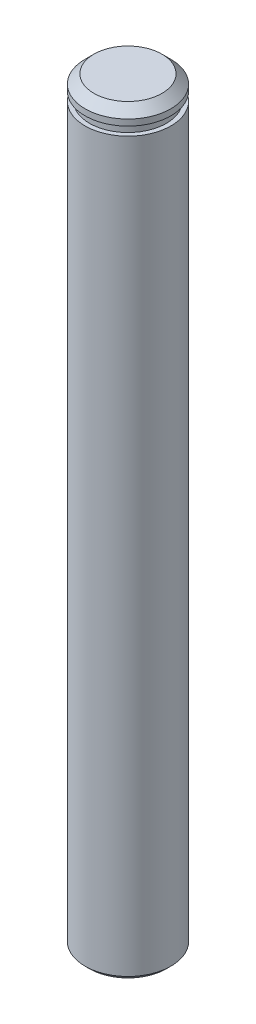
ISO-10303-21;
HEADER;
FILE_DESCRIPTION(('STEP AP214'),'2;1');
FILE_NAME('part.step','',(''),(''),'','','');
FILE_SCHEMA(('AUTOMOTIVE_DESIGN { 1 0 10303 214 1 1 1 1 }'));
ENDSEC;
DATA;
#1=APPLICATION_CONTEXT('core data for automotive mechanical design processes');
#2=APPLICATION_PROTOCOL_DEFINITION('international standard','automotive_design',2000,#1);
#3=PRODUCT_CONTEXT('',#1,'mechanical');
#4=PRODUCT('Part','Part','',(#3));
#5=PRODUCT_RELATED_PRODUCT_CATEGORY('part','',(#4));
#6=PRODUCT_DEFINITION_FORMATION('','',#4);
#7=PRODUCT_DEFINITION_CONTEXT('part definition',#1,'design');
#8=PRODUCT_DEFINITION('design','',#6,#7);
#9=PRODUCT_DEFINITION_SHAPE('','',#8);
#10=(LENGTH_UNIT() NAMED_UNIT(*) SI_UNIT(.MILLI.,.METRE.));
#11=(NAMED_UNIT(*) PLANE_ANGLE_UNIT() SI_UNIT($,.RADIAN.));
#12=(NAMED_UNIT(*) SI_UNIT($,.STERADIAN.) SOLID_ANGLE_UNIT());
#13=UNCERTAINTY_MEASURE_WITH_UNIT(LENGTH_MEASURE(1.E-05),#10,'distance_accuracy_value','');
#14=(GEOMETRIC_REPRESENTATION_CONTEXT(3) GLOBAL_UNCERTAINTY_ASSIGNED_CONTEXT((#13)) GLOBAL_UNIT_ASSIGNED_CONTEXT((#10,
#11,#12)) REPRESENTATION_CONTEXT('',''));
#15=CARTESIAN_POINT('',(0.,0.,0.));
#16=DIRECTION('',(0.,0.,1.));
#17=DIRECTION('',(1.,0.,0.));
#18=AXIS2_PLACEMENT_3D('',#15,#16,#17);
#19=CARTESIAN_POINT('',(0.,41.165,0.));
#20=DIRECTION('',(0.,-1.,0.));
#21=DIRECTION('',(1.,0.,0.));
#22=AXIS2_PLACEMENT_3D('',#19,#20,#21);
#23=PLANE('',#22);
#24=CARTESIAN_POINT('',(-4.825,41.165,0.));
#25=DIRECTION('',(0.,1.,0.));
#26=DIRECTION('',(-1.,0.,0.));
#27=AXIS2_PLACEMENT_3D('',#24,#25,#26);
#28=CIRCLE('',#27,4.325);
#29=CARTESIAN_POINT('',(-9.15,41.165,0.));
#30=VERTEX_POINT('',#29);
#31=EDGE_CURVE('E59',#30,#30,#28,.T.);
#32=ORIENTED_EDGE('',*,*,#31,.F.);
#33=EDGE_LOOP('',(#32));
#34=FACE_BOUND('',#33,.T.);
#35=CARTESIAN_POINT('',(-4.825,41.165,0.));
#36=DIRECTION('',(0.,1.,0.));
#37=DIRECTION('',(-1.,0.,0.));
#38=AXIS2_PLACEMENT_3D('',#35,#36,#37);
#39=CIRCLE('',#38,4.825);
#40=CARTESIAN_POINT('',(-9.65,41.165,0.));
#41=VERTEX_POINT('',#40);
#42=EDGE_CURVE('E10',#41,#41,#39,.T.);
#43=ORIENTED_EDGE('',*,*,#42,.T.);
#44=EDGE_LOOP('',(#43));
#45=FACE_BOUND('',#44,.T.);
#46=ADVANCED_FACE('F31',(#34,#45),#23,.F.);
#47=CARTESIAN_POINT('',(-4.825,43.835,0.));
#48=DIRECTION('',(0.,1.,0.));
#49=DIRECTION('',(-1.,0.,0.));
#50=AXIS2_PLACEMENT_3D('',#47,#48,#49);
#51=CYLINDRICAL_SURFACE('',#50,4.82499999999999);
#52=ORIENTED_EDGE('',*,*,#42,.F.);
#53=EDGE_LOOP('',(#52));
#54=FACE_BOUND('',#53,.T.);
#55=CARTESIAN_POINT('',(-4.82499999999999,-40.665,0.));
#56=DIRECTION('',(0.,1.,0.));
#57=DIRECTION('',(-1.,0.,0.));
#58=AXIS2_PLACEMENT_3D('',#55,#56,#57);
#59=CIRCLE('',#58,4.82499999999999);
#60=CARTESIAN_POINT('',(-9.64999999999997,-40.665,0.));
#61=VERTEX_POINT('',#60);
#62=EDGE_CURVE('E37',#61,#61,#59,.T.);
#63=ORIENTED_EDGE('',*,*,#62,.T.);
#64=EDGE_LOOP('',(#63));
#65=FACE_BOUND('',#64,.T.);
#66=ADVANCED_FACE('F66',(#54,#65),#51,.T.);
#67=CARTESIAN_POINT('',(-4.82499999999999,-41.165,0.));
#68=DIRECTION('',(0.,1.,0.));
#69=DIRECTION('',(-1.,0.,0.));
#70=AXIS2_PLACEMENT_3D('',#67,#68,#69);
#71=CONICAL_SURFACE('',#70,4.325,0.785398163397448);
#72=ORIENTED_EDGE('',*,*,#62,.F.);
#73=EDGE_LOOP('',(#72));
#74=FACE_BOUND('',#73,.T.);
#75=CARTESIAN_POINT('',(-4.82499999999999,-41.165,0.));
#76=DIRECTION('',(0.,1.,0.));
#77=DIRECTION('',(-1.,0.,0.));
#78=AXIS2_PLACEMENT_3D('',#75,#76,#77);
#79=CIRCLE('',#78,4.325);
#80=CARTESIAN_POINT('',(-9.14999999999999,-41.165,0.));
#81=VERTEX_POINT('',#80);
#82=EDGE_CURVE('E41',#81,#81,#79,.T.);
#83=ORIENTED_EDGE('',*,*,#82,.T.);
#84=EDGE_LOOP('',(#83));
#85=FACE_BOUND('',#84,.T.);
#86=ADVANCED_FACE('F70',(#74,#85),#71,.T.);
#87=CARTESIAN_POINT('',(-4.82499999999999,-41.165,0.));
#88=DIRECTION('',(0.,1.,0.));
#89=DIRECTION('',(-1.,0.,0.));
#90=AXIS2_PLACEMENT_3D('',#87,#88,#89);
#91=PLANE('',#90);
#92=ORIENTED_EDGE('',*,*,#82,.F.);
#93=EDGE_LOOP('',(#92));
#94=FACE_BOUND('',#93,.T.);
#95=ADVANCED_FACE('F75',(#94),#91,.F.);
#96=CARTESIAN_POINT('',(-1.00000000000004,43.835,0.));
#97=DIRECTION('',(0.,-1.,0.));
#98=DIRECTION('',(1.,0.,0.));
#99=AXIS2_PLACEMENT_3D('',#96,#97,#98);
#100=PLANE('',#99);
#101=CARTESIAN_POINT('',(-4.825,43.835,0.));
#102=DIRECTION('',(0.,1.,0.));
#103=DIRECTION('',(-1.,0.,0.));
#104=AXIS2_PLACEMENT_3D('',#101,#102,#103);
#105=CIRCLE('',#104,3.82499999999996);
#106=CARTESIAN_POINT('',(-8.64999999999996,43.835,0.));
#107=VERTEX_POINT('',#106);
#108=EDGE_CURVE('E45',#107,#107,#105,.T.);
#109=ORIENTED_EDGE('',*,*,#108,.T.);
#110=EDGE_LOOP('',(#109));
#111=FACE_BOUND('',#110,.T.);
#112=ADVANCED_FACE('F81',(#111),#100,.F.);
#113=CARTESIAN_POINT('',(-4.825,42.835,0.));
#114=DIRECTION('',(0.,-1.,0.));
#115=DIRECTION('',(1.,0.,0.));
#116=AXIS2_PLACEMENT_3D('',#113,#114,#115);
#117=CONICAL_SURFACE('',#116,4.825,0.78539816339746);
#118=ORIENTED_EDGE('',*,*,#108,.F.);
#119=EDGE_LOOP('',(#118));
#120=FACE_BOUND('',#119,.T.);
#121=CARTESIAN_POINT('',(-4.825,42.835,0.));
#122=DIRECTION('',(0.,1.,0.));
#123=DIRECTION('',(-1.,0.,0.));
#124=AXIS2_PLACEMENT_3D('',#121,#122,#123);
#125=CIRCLE('',#124,4.825);
#126=CARTESIAN_POINT('',(-9.65,42.835,0.));
#127=VERTEX_POINT('',#126);
#128=EDGE_CURVE('E50',#127,#127,#125,.T.);
#129=ORIENTED_EDGE('',*,*,#128,.T.);
#130=EDGE_LOOP('',(#129));
#131=FACE_BOUND('',#130,.T.);
#132=ADVANCED_FACE('F85',(#120,#131),#117,.T.);
#133=CARTESIAN_POINT('',(-4.825,43.835,0.));
#134=DIRECTION('',(0.,1.,0.));
#135=DIRECTION('',(-1.,0.,0.));
#136=AXIS2_PLACEMENT_3D('',#133,#134,#135);
#137=CYLINDRICAL_SURFACE('',#136,4.825);
#138=ORIENTED_EDGE('',*,*,#128,.F.);
#139=EDGE_LOOP('',(#138));
#140=FACE_BOUND('',#139,.T.);
#141=CARTESIAN_POINT('',(-4.825,42.145,0.));
#142=DIRECTION('',(0.,1.,0.));
#143=DIRECTION('',(-1.,0.,0.));
#144=AXIS2_PLACEMENT_3D('',#141,#142,#143);
#145=CIRCLE('',#144,4.825);
#146=CARTESIAN_POINT('',(-9.65,42.145,0.));
#147=VERTEX_POINT('',#146);
#148=EDGE_CURVE('E53',#147,#147,#145,.T.);
#149=ORIENTED_EDGE('',*,*,#148,.T.);
#150=EDGE_LOOP('',(#149));
#151=FACE_BOUND('',#150,.T.);
#152=ADVANCED_FACE('F89',(#140,#151),#137,.T.);
#153=CARTESIAN_POINT('',(-0.499999999999997,42.145,0.));
#154=DIRECTION('',(0.,1.,0.));
#155=DIRECTION('',(-1.,0.,0.));
#156=AXIS2_PLACEMENT_3D('',#153,#154,#155);
#157=PLANE('',#156);
#158=ORIENTED_EDGE('',*,*,#148,.F.);
#159=EDGE_LOOP('',(#158));
#160=FACE_BOUND('',#159,.T.);
#161=CARTESIAN_POINT('',(-4.825,42.145,0.));
#162=DIRECTION('',(0.,1.,0.));
#163=DIRECTION('',(-1.,0.,0.));
#164=AXIS2_PLACEMENT_3D('',#161,#162,#163);
#165=CIRCLE('',#164,4.325);
#166=CARTESIAN_POINT('',(-9.15,42.145,0.));
#167=VERTEX_POINT('',#166);
#168=EDGE_CURVE('E56',#167,#167,#165,.T.);
#169=ORIENTED_EDGE('',*,*,#168,.T.);
#170=EDGE_LOOP('',(#169));
#171=FACE_BOUND('',#170,.T.);
#172=ADVANCED_FACE('F93',(#160,#171),#157,.F.);
#173=CARTESIAN_POINT('',(-4.825,43.835,0.));
#174=DIRECTION('',(0.,1.,0.));
#175=DIRECTION('',(-1.,0.,0.));
#176=AXIS2_PLACEMENT_3D('',#173,#174,#175);
#177=CYLINDRICAL_SURFACE('',#176,4.325);
#178=ORIENTED_EDGE('',*,*,#168,.F.);
#179=EDGE_LOOP('',(#178));
#180=FACE_BOUND('',#179,.T.);
#181=ORIENTED_EDGE('',*,*,#31,.T.);
#182=EDGE_LOOP('',(#181));
#183=FACE_BOUND('',#182,.T.);
#184=ADVANCED_FACE('F63',(#180,#183),#177,.T.);
#185=CLOSED_SHELL('',(#46,#66,#86,#95,#112,#132,#152,#172,#184));
#186=MANIFOLD_SOLID_BREP('B2',#185);
#187=ADVANCED_BREP_SHAPE_REPRESENTATION('',(#18,#186),#14);
#188=SHAPE_DEFINITION_REPRESENTATION(#9,#187);
ENDSEC;
END-ISO-10303-21;
